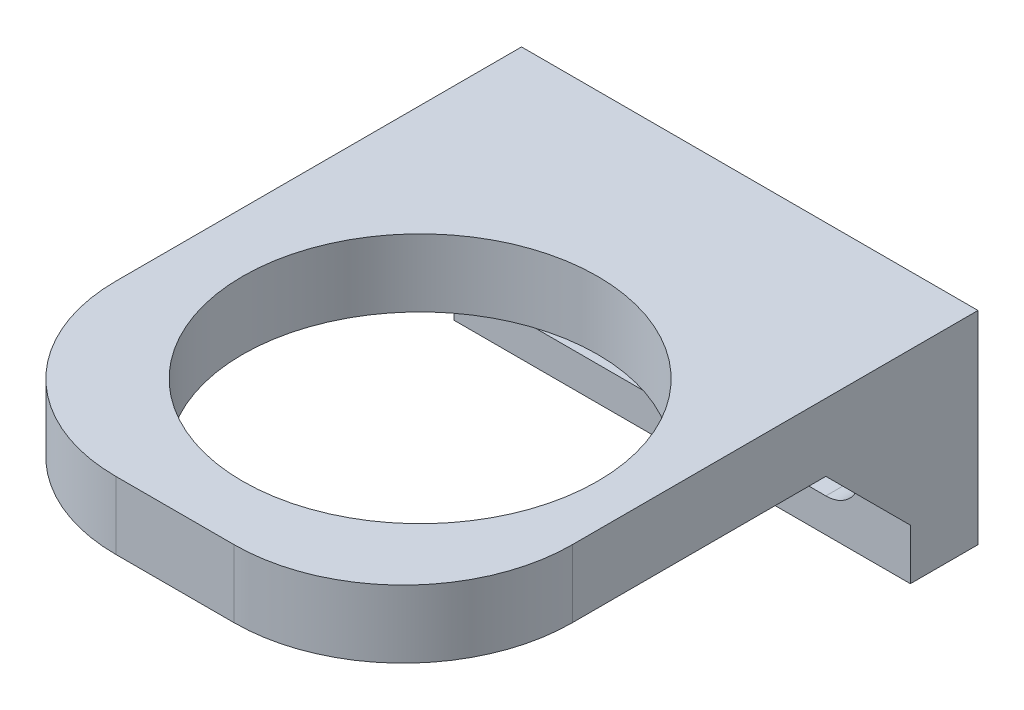
ISO-10303-21;
HEADER;
FILE_DESCRIPTION(('STEP AP214'),'2;1');
FILE_NAME('part.step','',(''),(''),'','','');
FILE_SCHEMA(('AUTOMOTIVE_DESIGN { 1 0 10303 214 1 1 1 1 }'));
ENDSEC;
DATA;
#1=APPLICATION_CONTEXT('core data for automotive mechanical design processes');
#2=APPLICATION_PROTOCOL_DEFINITION('international standard','automotive_design',2000,#1);
#3=PRODUCT_CONTEXT('',#1,'mechanical');
#4=PRODUCT('Part','Part','',(#3));
#5=PRODUCT_RELATED_PRODUCT_CATEGORY('part','',(#4));
#6=PRODUCT_DEFINITION_FORMATION('','',#4);
#7=PRODUCT_DEFINITION_CONTEXT('part definition',#1,'design');
#8=PRODUCT_DEFINITION('design','',#6,#7);
#9=PRODUCT_DEFINITION_SHAPE('','',#8);
#10=(LENGTH_UNIT() NAMED_UNIT(*) SI_UNIT(.MILLI.,.METRE.));
#11=(NAMED_UNIT(*) PLANE_ANGLE_UNIT() SI_UNIT($,.RADIAN.));
#12=(NAMED_UNIT(*) SI_UNIT($,.STERADIAN.) SOLID_ANGLE_UNIT());
#13=UNCERTAINTY_MEASURE_WITH_UNIT(LENGTH_MEASURE(1.E-05),#10,'distance_accuracy_value','');
#14=(GEOMETRIC_REPRESENTATION_CONTEXT(3) GLOBAL_UNCERTAINTY_ASSIGNED_CONTEXT((#13)) GLOBAL_UNIT_ASSIGNED_CONTEXT((#10,
#11,#12)) REPRESENTATION_CONTEXT('',''));
#15=CARTESIAN_POINT('',(0.,0.,0.));
#16=DIRECTION('',(0.,0.,1.));
#17=DIRECTION('',(1.,0.,0.));
#18=AXIS2_PLACEMENT_3D('',#15,#16,#17);
#19=CARTESIAN_POINT('',(0.,0.,0.));
#20=DIRECTION('',(0.,1.,0.));
#21=DIRECTION('',(0.,0.,1.));
#22=AXIS2_PLACEMENT_3D('',#19,#20,#21);
#23=PLANE('',#22);
#24=CARTESIAN_POINT('',(0.,0.,0.));
#25=DIRECTION('',(0.,1.,0.));
#26=DIRECTION('',(0.,0.,1.));
#27=AXIS2_PLACEMENT_3D('',#24,#25,#26);
#28=CIRCLE('',#27,10.5);
#29=CARTESIAN_POINT('',(0.,0.,10.5));
#30=VERTEX_POINT('',#29);
#31=EDGE_CURVE('E266',#30,#30,#28,.T.);
#32=ORIENTED_EDGE('',*,*,#31,.T.);
#33=EDGE_LOOP('',(#32));
#34=FACE_BOUND('',#33,.T.);
#35=DIRECTION('',(1.,0.,0.));
#36=VECTOR('',#35,1.);
#37=CARTESIAN_POINT('',(-14.,0.,14.));
#38=LINE('',#37,#36);
#39=CARTESIAN_POINT('',(-4.,0.,14.));
#40=VERTEX_POINT('',#39);
#41=CARTESIAN_POINT('',(3.,0.,14.));
#42=VERTEX_POINT('',#41);
#43=EDGE_CURVE('E252',#40,#42,#38,.T.);
#44=ORIENTED_EDGE('',*,*,#43,.F.);
#45=CARTESIAN_POINT('',(-4.,0.,4.));
#46=DIRECTION('',(0.,1.,0.));
#47=DIRECTION('',(0.,0.,1.));
#48=AXIS2_PLACEMENT_3D('',#45,#46,#47);
#49=CIRCLE('',#48,10.);
#50=CARTESIAN_POINT('',(-14.,0.,4.));
#51=VERTEX_POINT('',#50);
#52=EDGE_CURVE('E303',#40,#51,#49,.F.);
#53=ORIENTED_EDGE('',*,*,#52,.T.);
#54=DIRECTION('',(0.,0.,1.));
#55=VECTOR('',#54,1.);
#56=CARTESIAN_POINT('',(-14.,0.,-20.));
#57=LINE('',#56,#55);
#58=CARTESIAN_POINT('',(-14.,0.,-11.0000000000001));
#59=VERTEX_POINT('',#58);
#60=EDGE_CURVE('E238',#59,#51,#57,.T.);
#61=ORIENTED_EDGE('',*,*,#60,.F.);
#62=DIRECTION('',(-1.,0.,0.));
#63=VECTOR('',#62,1.);
#64=CARTESIAN_POINT('',(-12.,0.,-11.0000000000001));
#65=LINE('',#64,#63);
#66=CARTESIAN_POINT('',(-12.,0.,-11.0000000000001));
#67=VERTEX_POINT('',#66);
#68=EDGE_CURVE('E215',#67,#59,#65,.T.);
#69=ORIENTED_EDGE('',*,*,#68,.F.);
#70=DIRECTION('',(0.,0.,-1.));
#71=VECTOR('',#70,1.);
#72=CARTESIAN_POINT('',(-12.,0.,-11.0000000000001));
#73=LINE('',#72,#71);
#74=CARTESIAN_POINT('',(-12.,0.,-16.));
#75=VERTEX_POINT('',#74);
#76=EDGE_CURVE('E203',#67,#75,#73,.T.);
#77=ORIENTED_EDGE('',*,*,#76,.T.);
#78=DIRECTION('',(-1.,0.,0.));
#79=VECTOR('',#78,1.);
#80=CARTESIAN_POINT('',(-14.,0.,-16.));
#81=LINE('',#80,#79);
#82=CARTESIAN_POINT('',(11.,0.,-16.));
#83=VERTEX_POINT('',#82);
#84=EDGE_CURVE('E217',#83,#75,#81,.T.);
#85=ORIENTED_EDGE('',*,*,#84,.F.);
#86=DIRECTION('',(0.,0.,1.));
#87=VECTOR('',#86,1.);
#88=CARTESIAN_POINT('',(11.,0.,-16.));
#89=LINE('',#88,#87);
#90=CARTESIAN_POINT('',(11.,0.,-11.));
#91=VERTEX_POINT('',#90);
#92=EDGE_CURVE('E189',#83,#91,#89,.T.);
#93=ORIENTED_EDGE('',*,*,#92,.T.);
#94=DIRECTION('',(1.,0.,0.));
#95=VECTOR('',#94,1.);
#96=CARTESIAN_POINT('',(11.,0.,-11.));
#97=LINE('',#96,#95);
#98=CARTESIAN_POINT('',(13.,0.,-11.));
#99=VERTEX_POINT('',#98);
#100=EDGE_CURVE('E194',#91,#99,#97,.T.);
#101=ORIENTED_EDGE('',*,*,#100,.T.);
#102=DIRECTION('',(0.,0.,-1.));
#103=VECTOR('',#102,1.);
#104=CARTESIAN_POINT('',(13.,0.,-20.));
#105=LINE('',#104,#103);
#106=CARTESIAN_POINT('',(13.,0.,4.));
#107=VERTEX_POINT('',#106);
#108=EDGE_CURVE('E248',#107,#99,#105,.T.);
#109=ORIENTED_EDGE('',*,*,#108,.F.);
#110=CARTESIAN_POINT('',(3.,0.,4.));
#111=DIRECTION('',(0.,1.,0.));
#112=DIRECTION('',(0.,0.,1.));
#113=AXIS2_PLACEMENT_3D('',#110,#111,#112);
#114=CIRCLE('',#113,10.);
#115=EDGE_CURVE('E247',#107,#42,#114,.F.);
#116=ORIENTED_EDGE('',*,*,#115,.T.);
#117=EDGE_LOOP('',(#44,#53,#61,#69,#77,#85,#93,#101,#109,#116));
#118=FACE_BOUND('',#117,.T.);
#119=ADVANCED_FACE('F37',(#34,#118),#23,.F.);
#120=CARTESIAN_POINT('',(0.,4.,0.));
#121=DIRECTION('',(0.,1.,0.));
#122=DIRECTION('',(0.,0.,1.));
#123=AXIS2_PLACEMENT_3D('',#120,#121,#122);
#124=PLANE('',#123);
#125=DIRECTION('',(0.,0.,1.));
#126=VECTOR('',#125,1.);
#127=CARTESIAN_POINT('',(-14.,4.,-20.));
#128=LINE('',#127,#126);
#129=CARTESIAN_POINT('',(-14.,4.,-20.));
#130=VERTEX_POINT('',#129);
#131=CARTESIAN_POINT('',(-14.,4.,4.));
#132=VERTEX_POINT('',#131);
#133=EDGE_CURVE('E251',#130,#132,#128,.T.);
#134=ORIENTED_EDGE('',*,*,#133,.T.);
#135=CARTESIAN_POINT('',(-4.,4.,4.));
#136=DIRECTION('',(0.,1.,0.));
#137=DIRECTION('',(0.,0.,1.));
#138=AXIS2_PLACEMENT_3D('',#135,#136,#137);
#139=CIRCLE('',#138,10.);
#140=CARTESIAN_POINT('',(-4.,4.,14.));
#141=VERTEX_POINT('',#140);
#142=EDGE_CURVE('E45',#132,#141,#139,.T.);
#143=ORIENTED_EDGE('',*,*,#142,.T.);
#144=DIRECTION('',(1.,0.,0.));
#145=VECTOR('',#144,1.);
#146=CARTESIAN_POINT('',(-14.,4.,14.));
#147=LINE('',#146,#145);
#148=CARTESIAN_POINT('',(3.,4.,14.));
#149=VERTEX_POINT('',#148);
#150=EDGE_CURVE('E278',#141,#149,#147,.T.);
#151=ORIENTED_EDGE('',*,*,#150,.T.);
#152=CARTESIAN_POINT('',(3.,4.,4.));
#153=DIRECTION('',(0.,1.,0.));
#154=DIRECTION('',(0.,0.,1.));
#155=AXIS2_PLACEMENT_3D('',#152,#153,#154);
#156=CIRCLE('',#155,10.);
#157=CARTESIAN_POINT('',(13.,4.,4.));
#158=VERTEX_POINT('',#157);
#159=EDGE_CURVE('E302',#149,#158,#156,.T.);
#160=ORIENTED_EDGE('',*,*,#159,.T.);
#161=DIRECTION('',(0.,0.,-1.));
#162=VECTOR('',#161,1.);
#163=CARTESIAN_POINT('',(13.,4.,-20.));
#164=LINE('',#163,#162);
#165=CARTESIAN_POINT('',(13.,4.,-20.));
#166=VERTEX_POINT('',#165);
#167=EDGE_CURVE('E281',#158,#166,#164,.T.);
#168=ORIENTED_EDGE('',*,*,#167,.T.);
#169=DIRECTION('',(-1.,0.,0.));
#170=VECTOR('',#169,1.);
#171=CARTESIAN_POINT('',(-14.,4.,-20.));
#172=LINE('',#171,#170);
#173=EDGE_CURVE('E259',#166,#130,#172,.T.);
#174=ORIENTED_EDGE('',*,*,#173,.T.);
#175=EDGE_LOOP('',(#134,#143,#151,#160,#168,#174));
#176=FACE_BOUND('',#175,.T.);
#177=CARTESIAN_POINT('',(0.,4.,0.));
#178=DIRECTION('',(0.,1.,0.));
#179=DIRECTION('',(0.,0.,1.));
#180=AXIS2_PLACEMENT_3D('',#177,#178,#179);
#181=CIRCLE('',#180,10.5);
#182=CARTESIAN_POINT('',(0.,4.,10.5));
#183=VERTEX_POINT('',#182);
#184=EDGE_CURVE('E233',#183,#183,#181,.T.);
#185=ORIENTED_EDGE('',*,*,#184,.F.);
#186=EDGE_LOOP('',(#185));
#187=FACE_BOUND('',#186,.T.);
#188=ADVANCED_FACE('F287',(#176,#187),#124,.T.);
#189=CARTESIAN_POINT('',(-14.,4.,-20.));
#190=DIRECTION('',(1.,0.,0.));
#191=DIRECTION('',(0.,0.,-1.));
#192=AXIS2_PLACEMENT_3D('',#189,#190,#191);
#193=PLANE('',#192);
#194=ORIENTED_EDGE('',*,*,#60,.T.);
#195=DIRECTION('',(0.,-1.,0.));
#196=VECTOR('',#195,1.);
#197=CARTESIAN_POINT('',(-14.,4.,4.));
#198=LINE('',#197,#196);
#199=EDGE_CURVE('E299',#51,#132,#198,.F.);
#200=ORIENTED_EDGE('',*,*,#199,.T.);
#201=ORIENTED_EDGE('',*,*,#133,.F.);
#202=DIRECTION('',(0.,-1.,0.));
#203=VECTOR('',#202,1.);
#204=CARTESIAN_POINT('',(-14.,4.,-20.));
#205=LINE('',#204,#203);
#206=CARTESIAN_POINT('',(-14.,-8.,-20.));
#207=VERTEX_POINT('',#206);
#208=EDGE_CURVE('E257',#130,#207,#205,.T.);
#209=ORIENTED_EDGE('',*,*,#208,.T.);
#210=DIRECTION('',(0.,0.,-1.));
#211=VECTOR('',#210,1.);
#212=CARTESIAN_POINT('',(-14.,-8.,-20.));
#213=LINE('',#212,#211);
#214=CARTESIAN_POINT('',(-14.,-8.,-16.));
#215=VERTEX_POINT('',#214);
#216=EDGE_CURVE('E220',#215,#207,#213,.T.);
#217=ORIENTED_EDGE('',*,*,#216,.F.);
#218=DIRECTION('',(0.,1.,0.));
#219=VECTOR('',#218,1.);
#220=CARTESIAN_POINT('',(-14.,-8.,-16.));
#221=LINE('',#220,#219);
#222=CARTESIAN_POINT('',(-14.,-5.,-16.));
#223=VERTEX_POINT('',#222);
#224=EDGE_CURVE('E230',#215,#223,#221,.T.);
#225=ORIENTED_EDGE('',*,*,#224,.T.);
#226=DIRECTION('',(0.,0.707106781186551,0.707106781186544));
#227=VECTOR('',#226,1.);
#228=CARTESIAN_POINT('',(-14.,-5.,-16.));
#229=LINE('',#228,#227);
#230=EDGE_CURVE('E200',#223,#59,#229,.T.);
#231=ORIENTED_EDGE('',*,*,#230,.T.);
#232=EDGE_LOOP('',(#194,#200,#201,#209,#217,#225,#231));
#233=FACE_BOUND('',#232,.T.);
#234=ADVANCED_FACE('F297',(#233),#193,.F.);
#235=CARTESIAN_POINT('',(-14.,4.,14.));
#236=DIRECTION('',(0.,0.,-1.));
#237=DIRECTION('',(-1.,0.,0.));
#238=AXIS2_PLACEMENT_3D('',#235,#236,#237);
#239=PLANE('',#238);
#240=ORIENTED_EDGE('',*,*,#150,.F.);
#241=DIRECTION('',(0.,-1.,0.));
#242=VECTOR('',#241,1.);
#243=CARTESIAN_POINT('',(-4.,4.,14.));
#244=LINE('',#243,#242);
#245=EDGE_CURVE('E243',#141,#40,#244,.T.);
#246=ORIENTED_EDGE('',*,*,#245,.T.);
#247=ORIENTED_EDGE('',*,*,#43,.T.);
#248=DIRECTION('',(0.,-1.,0.));
#249=VECTOR('',#248,1.);
#250=CARTESIAN_POINT('',(3.,4.,14.));
#251=LINE('',#250,#249);
#252=EDGE_CURVE('E241',#42,#149,#251,.F.);
#253=ORIENTED_EDGE('',*,*,#252,.T.);
#254=EDGE_LOOP('',(#240,#246,#247,#253));
#255=FACE_BOUND('',#254,.T.);
#256=ADVANCED_FACE('F310',(#255),#239,.F.);
#257=CARTESIAN_POINT('',(13.,4.,-20.));
#258=DIRECTION('',(-1.,0.,0.));
#259=DIRECTION('',(0.,0.,1.));
#260=AXIS2_PLACEMENT_3D('',#257,#258,#259);
#261=PLANE('',#260);
#262=ORIENTED_EDGE('',*,*,#167,.F.);
#263=DIRECTION('',(0.,-1.,0.));
#264=VECTOR('',#263,1.);
#265=CARTESIAN_POINT('',(13.,4.,4.));
#266=LINE('',#265,#264);
#267=EDGE_CURVE('E11',#158,#107,#266,.T.);
#268=ORIENTED_EDGE('',*,*,#267,.T.);
#269=ORIENTED_EDGE('',*,*,#108,.T.);
#270=DIRECTION('',(0.,-0.707106781186544,-0.707106781186551));
#271=VECTOR('',#270,1.);
#272=CARTESIAN_POINT('',(13.,0.,-11.));
#273=LINE('',#272,#271);
#274=CARTESIAN_POINT('',(13.,-5.,-16.));
#275=VERTEX_POINT('',#274);
#276=EDGE_CURVE('E183',#99,#275,#273,.T.);
#277=ORIENTED_EDGE('',*,*,#276,.T.);
#278=DIRECTION('',(0.,1.,0.));
#279=VECTOR('',#278,1.);
#280=CARTESIAN_POINT('',(13.,-8.,-16.));
#281=LINE('',#280,#279);
#282=CARTESIAN_POINT('',(13.,-8.,-16.));
#283=VERTEX_POINT('',#282);
#284=EDGE_CURVE('E263',#283,#275,#281,.T.);
#285=ORIENTED_EDGE('',*,*,#284,.F.);
#286=DIRECTION('',(0.,0.,1.));
#287=VECTOR('',#286,1.);
#288=CARTESIAN_POINT('',(13.,-8.,-20.));
#289=LINE('',#288,#287);
#290=CARTESIAN_POINT('',(13.,-8.,-20.));
#291=VERTEX_POINT('',#290);
#292=EDGE_CURVE('E226',#291,#283,#289,.T.);
#293=ORIENTED_EDGE('',*,*,#292,.F.);
#294=DIRECTION('',(0.,-1.,0.));
#295=VECTOR('',#294,1.);
#296=CARTESIAN_POINT('',(13.,4.,-20.));
#297=LINE('',#296,#295);
#298=EDGE_CURVE('E244',#166,#291,#297,.T.);
#299=ORIENTED_EDGE('',*,*,#298,.F.);
#300=EDGE_LOOP('',(#262,#268,#269,#277,#285,#293,#299));
#301=FACE_BOUND('',#300,.T.);
#302=ADVANCED_FACE('F321',(#301),#261,.F.);
#303=CARTESIAN_POINT('',(-14.,4.,-20.));
#304=DIRECTION('',(0.,0.,1.));
#305=DIRECTION('',(1.,0.,0.));
#306=AXIS2_PLACEMENT_3D('',#303,#304,#305);
#307=PLANE('',#306);
#308=DIRECTION('',(-1.,0.,0.));
#309=VECTOR('',#308,1.);
#310=CARTESIAN_POINT('',(-9.,-2.,-20.));
#311=LINE('',#310,#309);
#312=CARTESIAN_POINT('',(8.,-2.,-20.));
#313=VERTEX_POINT('',#312);
#314=CARTESIAN_POINT('',(-9.,-2.,-20.));
#315=VERTEX_POINT('',#314);
#316=EDGE_CURVE('E158',#313,#315,#311,.T.);
#317=ORIENTED_EDGE('',*,*,#316,.T.);
#318=CARTESIAN_POINT('',(-9.,-4.,-20.));
#319=DIRECTION('',(0.,0.,1.));
#320=DIRECTION('',(1.,0.,0.));
#321=AXIS2_PLACEMENT_3D('',#318,#319,#320);
#322=CIRCLE('',#321,2.);
#323=CARTESIAN_POINT('',(-9.,-6.,-20.));
#324=VERTEX_POINT('',#323);
#325=EDGE_CURVE('E152',#315,#324,#322,.T.);
#326=ORIENTED_EDGE('',*,*,#325,.T.);
#327=DIRECTION('',(1.,0.,0.));
#328=VECTOR('',#327,1.);
#329=CARTESIAN_POINT('',(-9.,-6.,-20.));
#330=LINE('',#329,#328);
#331=CARTESIAN_POINT('',(8.,-6.,-20.));
#332=VERTEX_POINT('',#331);
#333=EDGE_CURVE('E161',#324,#332,#330,.T.);
#334=ORIENTED_EDGE('',*,*,#333,.T.);
#335=CARTESIAN_POINT('',(8.,-4.,-20.));
#336=DIRECTION('',(0.,0.,1.));
#337=DIRECTION('',(1.,0.,0.));
#338=AXIS2_PLACEMENT_3D('',#335,#336,#337);
#339=CIRCLE('',#338,2.);
#340=EDGE_CURVE('E52',#332,#313,#339,.T.);
#341=ORIENTED_EDGE('',*,*,#340,.T.);
#342=EDGE_LOOP('',(#317,#326,#334,#341));
#343=FACE_BOUND('',#342,.T.);
#344=ORIENTED_EDGE('',*,*,#298,.T.);
#345=DIRECTION('',(1.,0.,0.));
#346=VECTOR('',#345,1.);
#347=CARTESIAN_POINT('',(-14.,-8.,-20.));
#348=LINE('',#347,#346);
#349=EDGE_CURVE('E223',#207,#291,#348,.T.);
#350=ORIENTED_EDGE('',*,*,#349,.F.);
#351=ORIENTED_EDGE('',*,*,#208,.F.);
#352=ORIENTED_EDGE('',*,*,#173,.F.);
#353=EDGE_LOOP('',(#344,#350,#351,#352));
#354=FACE_BOUND('',#353,.T.);
#355=ADVANCED_FACE('F165',(#343,#354),#307,.F.);
#356=CARTESIAN_POINT('',(0.,4.,0.));
#357=DIRECTION('',(0.,-1.,0.));
#358=DIRECTION('',(0.,0.,-1.));
#359=AXIS2_PLACEMENT_3D('',#356,#357,#358);
#360=CYLINDRICAL_SURFACE('',#359,10.5);
#361=ORIENTED_EDGE('',*,*,#184,.T.);
#362=EDGE_LOOP('',(#361));
#363=FACE_BOUND('',#362,.T.);
#364=ORIENTED_EDGE('',*,*,#31,.F.);
#365=EDGE_LOOP('',(#364));
#366=FACE_BOUND('',#365,.T.);
#367=ADVANCED_FACE('F361',(#363,#366),#360,.F.);
#368=CARTESIAN_POINT('',(-14.,-8.,-16.));
#369=DIRECTION('',(0.,0.,-1.));
#370=DIRECTION('',(-1.,0.,0.));
#371=AXIS2_PLACEMENT_3D('',#368,#369,#370);
#372=PLANE('',#371);
#373=DIRECTION('',(1.,0.,0.));
#374=VECTOR('',#373,1.);
#375=CARTESIAN_POINT('',(-9.,-6.,-16.));
#376=LINE('',#375,#374);
#377=CARTESIAN_POINT('',(-9.,-6.,-16.));
#378=VERTEX_POINT('',#377);
#379=CARTESIAN_POINT('',(8.,-6.,-16.));
#380=VERTEX_POINT('',#379);
#381=EDGE_CURVE('E177',#378,#380,#376,.T.);
#382=ORIENTED_EDGE('',*,*,#381,.F.);
#383=CARTESIAN_POINT('',(-9.,-4.,-16.));
#384=DIRECTION('',(0.,0.,1.));
#385=DIRECTION('',(1.,0.,0.));
#386=AXIS2_PLACEMENT_3D('',#383,#384,#385);
#387=CIRCLE('',#386,2.);
#388=CARTESIAN_POINT('',(-9.,-2.,-16.));
#389=VERTEX_POINT('',#388);
#390=EDGE_CURVE('E60',#389,#378,#387,.T.);
#391=ORIENTED_EDGE('',*,*,#390,.F.);
#392=DIRECTION('',(-1.,0.,0.));
#393=VECTOR('',#392,1.);
#394=CARTESIAN_POINT('',(-9.,-2.,-16.));
#395=LINE('',#394,#393);
#396=CARTESIAN_POINT('',(8.,-2.,-16.));
#397=VERTEX_POINT('',#396);
#398=EDGE_CURVE('E168',#397,#389,#395,.T.);
#399=ORIENTED_EDGE('',*,*,#398,.F.);
#400=CARTESIAN_POINT('',(8.,-4.,-16.));
#401=DIRECTION('',(0.,0.,1.));
#402=DIRECTION('',(1.,0.,0.));
#403=AXIS2_PLACEMENT_3D('',#400,#401,#402);
#404=CIRCLE('',#403,2.);
#405=EDGE_CURVE('E171',#380,#397,#404,.T.);
#406=ORIENTED_EDGE('',*,*,#405,.F.);
#407=EDGE_LOOP('',(#382,#391,#399,#406));
#408=FACE_BOUND('',#407,.T.);
#409=ORIENTED_EDGE('',*,*,#284,.T.);
#410=DIRECTION('',(1.,0.,0.));
#411=VECTOR('',#410,1.);
#412=CARTESIAN_POINT('',(11.,-5.,-16.));
#413=LINE('',#412,#411);
#414=CARTESIAN_POINT('',(11.,-5.,-16.));
#415=VERTEX_POINT('',#414);
#416=EDGE_CURVE('E197',#415,#275,#413,.T.);
#417=ORIENTED_EDGE('',*,*,#416,.F.);
#418=DIRECTION('',(0.,1.,0.));
#419=VECTOR('',#418,1.);
#420=CARTESIAN_POINT('',(11.,-5.,-16.));
#421=LINE('',#420,#419);
#422=EDGE_CURVE('E187',#415,#83,#421,.T.);
#423=ORIENTED_EDGE('',*,*,#422,.T.);
#424=ORIENTED_EDGE('',*,*,#84,.T.);
#425=DIRECTION('',(0.,-1.,0.));
#426=VECTOR('',#425,1.);
#427=CARTESIAN_POINT('',(-12.,0.,-16.));
#428=LINE('',#427,#426);
#429=CARTESIAN_POINT('',(-12.,-5.,-16.));
#430=VERTEX_POINT('',#429);
#431=EDGE_CURVE('E206',#75,#430,#428,.T.);
#432=ORIENTED_EDGE('',*,*,#431,.T.);
#433=DIRECTION('',(-1.,0.,0.));
#434=VECTOR('',#433,1.);
#435=CARTESIAN_POINT('',(-12.,-5.,-16.));
#436=LINE('',#435,#434);
#437=EDGE_CURVE('E212',#430,#223,#436,.T.);
#438=ORIENTED_EDGE('',*,*,#437,.T.);
#439=ORIENTED_EDGE('',*,*,#224,.F.);
#440=DIRECTION('',(-1.,0.,0.));
#441=VECTOR('',#440,1.);
#442=CARTESIAN_POINT('',(-14.,-8.,-16.));
#443=LINE('',#442,#441);
#444=EDGE_CURVE('E228',#283,#215,#443,.T.);
#445=ORIENTED_EDGE('',*,*,#444,.F.);
#446=EDGE_LOOP('',(#409,#417,#423,#424,#432,#438,#439,#445));
#447=FACE_BOUND('',#446,.T.);
#448=ADVANCED_FACE('F326',(#408,#447),#372,.F.);
#449=CARTESIAN_POINT('',(0.,-8.,0.));
#450=DIRECTION('',(0.,1.,0.));
#451=DIRECTION('',(0.,0.,1.));
#452=AXIS2_PLACEMENT_3D('',#449,#450,#451);
#453=PLANE('',#452);
#454=ORIENTED_EDGE('',*,*,#216,.T.);
#455=ORIENTED_EDGE('',*,*,#349,.T.);
#456=ORIENTED_EDGE('',*,*,#292,.T.);
#457=ORIENTED_EDGE('',*,*,#444,.T.);
#458=EDGE_LOOP('',(#454,#455,#456,#457));
#459=FACE_BOUND('',#458,.T.);
#460=ADVANCED_FACE('F324',(#459),#453,.F.);
#461=CARTESIAN_POINT('',(-12.,-5.,-16.));
#462=DIRECTION('',(0.,-0.707106781186544,0.707106781186551));
#463=DIRECTION('',(0.,-0.707106781186551,-0.707106781186544));
#464=AXIS2_PLACEMENT_3D('',#461,#462,#463);
#465=PLANE('',#464);
#466=ORIENTED_EDGE('',*,*,#230,.F.);
#467=ORIENTED_EDGE('',*,*,#437,.F.);
#468=DIRECTION('',(0.,0.707106781186551,0.707106781186544));
#469=VECTOR('',#468,1.);
#470=CARTESIAN_POINT('',(-12.,-5.,-16.));
#471=LINE('',#470,#469);
#472=EDGE_CURVE('E209',#430,#67,#471,.T.);
#473=ORIENTED_EDGE('',*,*,#472,.T.);
#474=ORIENTED_EDGE('',*,*,#68,.T.);
#475=EDGE_LOOP('',(#466,#467,#473,#474));
#476=FACE_BOUND('',#475,.T.);
#477=ADVANCED_FACE('F330',(#476),#465,.T.);
#478=CARTESIAN_POINT('',(-12.,0.,0.));
#479=DIRECTION('',(-1.,0.,0.));
#480=DIRECTION('',(0.,0.,1.));
#481=AXIS2_PLACEMENT_3D('',#478,#479,#480);
#482=PLANE('',#481);
#483=ORIENTED_EDGE('',*,*,#76,.F.);
#484=ORIENTED_EDGE('',*,*,#472,.F.);
#485=ORIENTED_EDGE('',*,*,#431,.F.);
#486=EDGE_LOOP('',(#483,#484,#485));
#487=FACE_BOUND('',#486,.T.);
#488=ADVANCED_FACE('F332',(#487),#482,.F.);
#489=CARTESIAN_POINT('',(11.,0.,-11.));
#490=DIRECTION('',(0.,-0.707106781186551,0.707106781186544));
#491=DIRECTION('',(0.,-0.707106781186544,-0.707106781186551));
#492=AXIS2_PLACEMENT_3D('',#489,#490,#491);
#493=PLANE('',#492);
#494=ORIENTED_EDGE('',*,*,#276,.F.);
#495=ORIENTED_EDGE('',*,*,#100,.F.);
#496=DIRECTION('',(0.,-0.707106781186544,-0.707106781186551));
#497=VECTOR('',#496,1.);
#498=CARTESIAN_POINT('',(11.,0.,-11.));
#499=LINE('',#498,#497);
#500=EDGE_CURVE('E191',#91,#415,#499,.T.);
#501=ORIENTED_EDGE('',*,*,#500,.T.);
#502=ORIENTED_EDGE('',*,*,#416,.T.);
#503=EDGE_LOOP('',(#494,#495,#501,#502));
#504=FACE_BOUND('',#503,.T.);
#505=ADVANCED_FACE('F342',(#504),#493,.T.);
#506=CARTESIAN_POINT('',(11.,0.,0.));
#507=DIRECTION('',(1.,0.,0.));
#508=DIRECTION('',(0.,0.,-1.));
#509=AXIS2_PLACEMENT_3D('',#506,#507,#508);
#510=PLANE('',#509);
#511=ORIENTED_EDGE('',*,*,#422,.F.);
#512=ORIENTED_EDGE('',*,*,#500,.F.);
#513=ORIENTED_EDGE('',*,*,#92,.F.);
#514=EDGE_LOOP('',(#511,#512,#513));
#515=FACE_BOUND('',#514,.T.);
#516=ADVANCED_FACE('F339',(#515),#510,.F.);
#517=CARTESIAN_POINT('',(-4.,4.,4.));
#518=DIRECTION('',(0.,-1.,0.));
#519=DIRECTION('',(0.,0.,-1.));
#520=AXIS2_PLACEMENT_3D('',#517,#518,#519);
#521=CYLINDRICAL_SURFACE('',#520,10.);
#522=ORIENTED_EDGE('',*,*,#142,.F.);
#523=ORIENTED_EDGE('',*,*,#199,.F.);
#524=ORIENTED_EDGE('',*,*,#52,.F.);
#525=ORIENTED_EDGE('',*,*,#245,.F.);
#526=EDGE_LOOP('',(#522,#523,#524,#525));
#527=FACE_BOUND('',#526,.T.);
#528=ADVANCED_FACE('F314',(#527),#521,.T.);
#529=CARTESIAN_POINT('',(3.,4.,4.));
#530=DIRECTION('',(0.,-1.,0.));
#531=DIRECTION('',(0.,0.,-1.));
#532=AXIS2_PLACEMENT_3D('',#529,#530,#531);
#533=CYLINDRICAL_SURFACE('',#532,10.);
#534=ORIENTED_EDGE('',*,*,#159,.F.);
#535=ORIENTED_EDGE('',*,*,#252,.F.);
#536=ORIENTED_EDGE('',*,*,#115,.F.);
#537=ORIENTED_EDGE('',*,*,#267,.F.);
#538=EDGE_LOOP('',(#534,#535,#536,#537));
#539=FACE_BOUND('',#538,.T.);
#540=ADVANCED_FACE('F39',(#539),#533,.T.);
#541=CARTESIAN_POINT('',(-9.,-4.,-20.));
#542=DIRECTION('',(0.,0.,1.));
#543=DIRECTION('',(1.,0.,0.));
#544=AXIS2_PLACEMENT_3D('',#541,#542,#543);
#545=CYLINDRICAL_SURFACE('',#544,2.);
#546=ORIENTED_EDGE('',*,*,#390,.T.);
#547=DIRECTION('',(0.,0.,1.));
#548=VECTOR('',#547,1.);
#549=CARTESIAN_POINT('',(-9.,-6.,-20.));
#550=LINE('',#549,#548);
#551=EDGE_CURVE('E148',#324,#378,#550,.T.);
#552=ORIENTED_EDGE('',*,*,#551,.F.);
#553=ORIENTED_EDGE('',*,*,#325,.F.);
#554=DIRECTION('',(0.,0.,1.));
#555=VECTOR('',#554,1.);
#556=CARTESIAN_POINT('',(-9.,-2.,-20.));
#557=LINE('',#556,#555);
#558=EDGE_CURVE('E181',#315,#389,#557,.T.);
#559=ORIENTED_EDGE('',*,*,#558,.T.);
#560=EDGE_LOOP('',(#546,#552,#553,#559));
#561=FACE_BOUND('',#560,.T.);
#562=ADVANCED_FACE('F150',(#561),#545,.F.);
#563=CARTESIAN_POINT('',(-9.,-2.,-20.));
#564=DIRECTION('',(0.,1.,0.));
#565=DIRECTION('',(0.,0.,1.));
#566=AXIS2_PLACEMENT_3D('',#563,#564,#565);
#567=PLANE('',#566);
#568=ORIENTED_EDGE('',*,*,#398,.T.);
#569=ORIENTED_EDGE('',*,*,#558,.F.);
#570=ORIENTED_EDGE('',*,*,#316,.F.);
#571=DIRECTION('',(0.,0.,1.));
#572=VECTOR('',#571,1.);
#573=CARTESIAN_POINT('',(8.,-2.,-20.));
#574=LINE('',#573,#572);
#575=EDGE_CURVE('E184',#313,#397,#574,.T.);
#576=ORIENTED_EDGE('',*,*,#575,.T.);
#577=EDGE_LOOP('',(#568,#569,#570,#576));
#578=FACE_BOUND('',#577,.T.);
#579=ADVANCED_FACE('F374',(#578),#567,.F.);
#580=CARTESIAN_POINT('',(8.,-4.,-20.));
#581=DIRECTION('',(0.,0.,1.));
#582=DIRECTION('',(1.,0.,0.));
#583=AXIS2_PLACEMENT_3D('',#580,#581,#582);
#584=CYLINDRICAL_SURFACE('',#583,2.);
#585=ORIENTED_EDGE('',*,*,#405,.T.);
#586=ORIENTED_EDGE('',*,*,#575,.F.);
#587=ORIENTED_EDGE('',*,*,#340,.F.);
#588=DIRECTION('',(0.,0.,1.));
#589=VECTOR('',#588,1.);
#590=CARTESIAN_POINT('',(8.,-6.,-20.));
#591=LINE('',#590,#589);
#592=EDGE_CURVE('E157',#332,#380,#591,.T.);
#593=ORIENTED_EDGE('',*,*,#592,.T.);
#594=EDGE_LOOP('',(#585,#586,#587,#593));
#595=FACE_BOUND('',#594,.T.);
#596=ADVANCED_FACE('F379',(#595),#584,.F.);
#597=CARTESIAN_POINT('',(-9.,-6.,-20.));
#598=DIRECTION('',(0.,-1.,0.));
#599=DIRECTION('',(0.,0.,-1.));
#600=AXIS2_PLACEMENT_3D('',#597,#598,#599);
#601=PLANE('',#600);
#602=ORIENTED_EDGE('',*,*,#381,.T.);
#603=ORIENTED_EDGE('',*,*,#592,.F.);
#604=ORIENTED_EDGE('',*,*,#333,.F.);
#605=ORIENTED_EDGE('',*,*,#551,.T.);
#606=EDGE_LOOP('',(#602,#603,#604,#605));
#607=FACE_BOUND('',#606,.T.);
#608=ADVANCED_FACE('F162',(#607),#601,.F.);
#609=CLOSED_SHELL('',(#119,#188,#234,#256,#302,#355,#367,#448,#460,#477,#488,#505,#516,#528,
#540,#562,#579,#596,#608));
#610=MANIFOLD_SOLID_BREP('B2',#609);
#611=ADVANCED_BREP_SHAPE_REPRESENTATION('',(#18,#610),#14);
#612=SHAPE_DEFINITION_REPRESENTATION(#9,#611);
ENDSEC;
END-ISO-10303-21;
